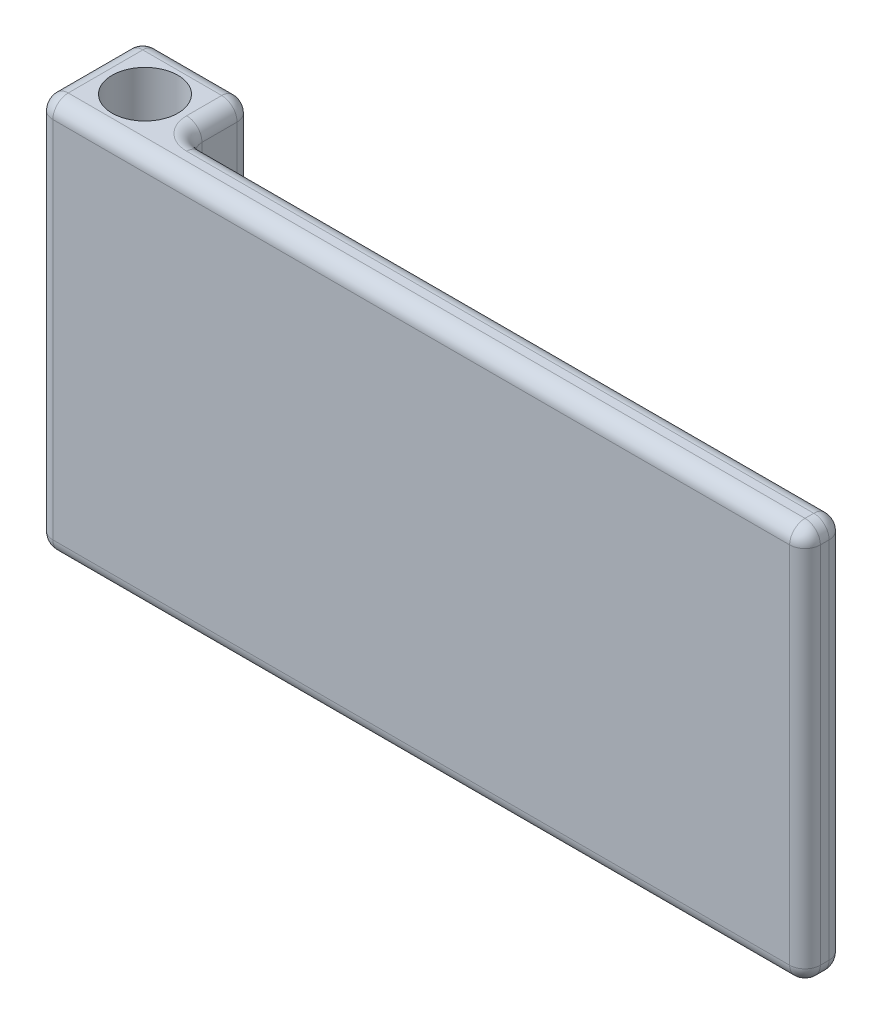
ISO-10303-21;
HEADER;
FILE_DESCRIPTION(('STEP AP214'),'2;1');
FILE_NAME('part.step','',(''),(''),'','','');
FILE_SCHEMA(('AUTOMOTIVE_DESIGN { 1 0 10303 214 1 1 1 1 }'));
ENDSEC;
DATA;
#1=APPLICATION_CONTEXT('core data for automotive mechanical design processes');
#2=APPLICATION_PROTOCOL_DEFINITION('international standard','automotive_design',2000,#1);
#3=PRODUCT_CONTEXT('',#1,'mechanical');
#4=PRODUCT('Part','Part','',(#3));
#5=PRODUCT_RELATED_PRODUCT_CATEGORY('part','',(#4));
#6=PRODUCT_DEFINITION_FORMATION('','',#4);
#7=PRODUCT_DEFINITION_CONTEXT('part definition',#1,'design');
#8=PRODUCT_DEFINITION('design','',#6,#7);
#9=PRODUCT_DEFINITION_SHAPE('','',#8);
#10=(LENGTH_UNIT() NAMED_UNIT(*) SI_UNIT(.MILLI.,.METRE.));
#11=(NAMED_UNIT(*) PLANE_ANGLE_UNIT() SI_UNIT($,.RADIAN.));
#12=(NAMED_UNIT(*) SI_UNIT($,.STERADIAN.) SOLID_ANGLE_UNIT());
#13=UNCERTAINTY_MEASURE_WITH_UNIT(LENGTH_MEASURE(1.E-05),#10,'distance_accuracy_value','');
#14=(GEOMETRIC_REPRESENTATION_CONTEXT(3) GLOBAL_UNCERTAINTY_ASSIGNED_CONTEXT((#13)) GLOBAL_UNIT_ASSIGNED_CONTEXT((#10,
#11,#12)) REPRESENTATION_CONTEXT('',''));
#15=CARTESIAN_POINT('',(0.,0.,0.));
#16=DIRECTION('',(0.,0.,1.));
#17=DIRECTION('',(1.,0.,0.));
#18=AXIS2_PLACEMENT_3D('',#15,#16,#17);
#19=CARTESIAN_POINT('',(0.,0.,-12.));
#20=DIRECTION('',(-1.,0.,0.));
#21=DIRECTION('',(0.,0.,1.));
#22=AXIS2_PLACEMENT_3D('',#19,#20,#21);
#23=PLANE('',#22);
#24=DIRECTION('',(0.,-1.,0.));
#25=VECTOR('',#24,1.);
#26=CARTESIAN_POINT('',(0.,0.,-8.5));
#27=LINE('',#26,#25);
#28=CARTESIAN_POINT('',(0.,86.5,-8.5));
#29=VERTEX_POINT('',#28);
#30=CARTESIAN_POINT('',(0.,3.5,-8.5));
#31=VERTEX_POINT('',#30);
#32=EDGE_CURVE('E349',#29,#31,#27,.T.);
#33=ORIENTED_EDGE('',*,*,#32,.T.);
#34=DIRECTION('',(0.,0.,1.));
#35=VECTOR('',#34,1.);
#36=CARTESIAN_POINT('',(0.,3.5,-12.));
#37=LINE('',#36,#35);
#38=CARTESIAN_POINT('',(0.,3.5,8.5));
#39=VERTEX_POINT('',#38);
#40=EDGE_CURVE('E427',#31,#39,#37,.T.);
#41=ORIENTED_EDGE('',*,*,#40,.T.);
#42=DIRECTION('',(0.,-1.,0.));
#43=VECTOR('',#42,1.);
#44=CARTESIAN_POINT('',(0.,86.5,8.5));
#45=LINE('',#44,#43);
#46=CARTESIAN_POINT('',(0.,86.5,8.5));
#47=VERTEX_POINT('',#46);
#48=EDGE_CURVE('E424',#39,#47,#45,.F.);
#49=ORIENTED_EDGE('',*,*,#48,.T.);
#50=DIRECTION('',(0.,0.,1.));
#51=VECTOR('',#50,1.);
#52=CARTESIAN_POINT('',(0.,86.5,-12.));
#53=LINE('',#52,#51);
#54=EDGE_CURVE('E421',#47,#29,#53,.F.);
#55=ORIENTED_EDGE('',*,*,#54,.T.);
#56=EDGE_LOOP('',(#33,#41,#49,#55));
#57=FACE_BOUND('',#56,.T.);
#58=ADVANCED_FACE('F47',(#57),#23,.T.);
#59=CARTESIAN_POINT('',(0.,90.,-12.));
#60=DIRECTION('',(0.,1.,0.));
#61=DIRECTION('',(0.,0.,1.));
#62=AXIS2_PLACEMENT_3D('',#59,#60,#61);
#63=PLANE('',#62);
#64=CARTESIAN_POINT('',(12.5,90.,0.));
#65=DIRECTION('',(0.,1.,0.));
#66=DIRECTION('',(0.,0.,1.));
#67=AXIS2_PLACEMENT_3D('',#64,#65,#66);
#68=CIRCLE('',#67,7.5);
#69=CARTESIAN_POINT('',(12.5,90.,7.5));
#70=VERTEX_POINT('',#69);
#71=EDGE_CURVE('E343',#70,#70,#68,.T.);
#72=ORIENTED_EDGE('',*,*,#71,.F.);
#73=EDGE_LOOP('',(#72));
#74=FACE_BOUND('',#73,.T.);
#75=DIRECTION('',(-1.,0.,0.));
#76=VECTOR('',#75,1.);
#77=CARTESIAN_POINT('',(0.,90.,-8.5));
#78=LINE('',#77,#76);
#79=CARTESIAN_POINT('',(21.5,90.,-8.5));
#80=VERTEX_POINT('',#79);
#81=CARTESIAN_POINT('',(3.5,90.,-8.5));
#82=VERTEX_POINT('',#81);
#83=EDGE_CURVE('E65',#80,#82,#78,.T.);
#84=ORIENTED_EDGE('',*,*,#83,.T.);
#85=DIRECTION('',(0.,0.,1.));
#86=VECTOR('',#85,1.);
#87=CARTESIAN_POINT('',(3.5,90.,-12.));
#88=LINE('',#87,#86);
#89=CARTESIAN_POINT('',(3.5,90.,8.5));
#90=VERTEX_POINT('',#89);
#91=EDGE_CURVE('E240',#82,#90,#88,.T.);
#92=ORIENTED_EDGE('',*,*,#91,.T.);
#93=DIRECTION('',(-1.,0.,0.));
#94=VECTOR('',#93,1.);
#95=CARTESIAN_POINT('',(175.,90.,8.5));
#96=LINE('',#95,#94);
#97=CARTESIAN_POINT('',(171.5,90.,8.5));
#98=VERTEX_POINT('',#97);
#99=EDGE_CURVE('E215',#90,#98,#96,.F.);
#100=ORIENTED_EDGE('',*,*,#99,.T.);
#101=DIRECTION('',(0.,0.,1.));
#102=VECTOR('',#101,1.);
#103=CARTESIAN_POINT('',(171.5,90.,-12.));
#104=LINE('',#103,#102);
#105=CARTESIAN_POINT('',(171.5,90.,6.5));
#106=VERTEX_POINT('',#105);
#107=EDGE_CURVE('E230',#98,#106,#104,.F.);
#108=ORIENTED_EDGE('',*,*,#107,.T.);
#109=DIRECTION('',(1.,0.,0.));
#110=VECTOR('',#109,1.);
#111=CARTESIAN_POINT('',(28.5,90.,6.5));
#112=LINE('',#111,#110);
#113=CARTESIAN_POINT('',(28.5,90.,6.5));
#114=VERTEX_POINT('',#113);
#115=EDGE_CURVE('E223',#106,#114,#112,.F.);
#116=ORIENTED_EDGE('',*,*,#115,.T.);
#117=CARTESIAN_POINT('',(28.5,90.,-0.499999999999997));
#118=DIRECTION('',(0.,1.,0.));
#119=DIRECTION('',(0.,0.,1.));
#120=AXIS2_PLACEMENT_3D('',#117,#118,#119);
#121=CIRCLE('',#120,7.);
#122=CARTESIAN_POINT('',(21.5,90.,-0.499999999999995));
#123=VERTEX_POINT('',#122);
#124=EDGE_CURVE('E233',#114,#123,#121,.F.);
#125=ORIENTED_EDGE('',*,*,#124,.T.);
#126=DIRECTION('',(0.,0.,1.));
#127=VECTOR('',#126,1.);
#128=CARTESIAN_POINT('',(21.5,90.,-8.5));
#129=LINE('',#128,#127);
#130=EDGE_CURVE('E70',#123,#80,#129,.F.);
#131=ORIENTED_EDGE('',*,*,#130,.T.);
#132=EDGE_LOOP('',(#84,#92,#100,#108,#116,#125,#131));
#133=FACE_BOUND('',#132,.T.);
#134=ADVANCED_FACE('F514',(#74,#133),#63,.T.);
#135=CARTESIAN_POINT('',(175.,0.,-12.));
#136=DIRECTION('',(1.,0.,0.));
#137=DIRECTION('',(0.,0.,-1.));
#138=AXIS2_PLACEMENT_3D('',#135,#136,#137);
#139=PLANE('',#138);
#140=DIRECTION('',(0.,1.,0.));
#141=VECTOR('',#140,1.);
#142=CARTESIAN_POINT('',(175.,0.,8.5));
#143=LINE('',#142,#141);
#144=CARTESIAN_POINT('',(175.,86.5,8.5));
#145=VERTEX_POINT('',#144);
#146=CARTESIAN_POINT('',(175.,3.5,8.5));
#147=VERTEX_POINT('',#146);
#148=EDGE_CURVE('E187',#145,#147,#143,.F.);
#149=ORIENTED_EDGE('',*,*,#148,.T.);
#150=DIRECTION('',(0.,0.,1.));
#151=VECTOR('',#150,1.);
#152=CARTESIAN_POINT('',(175.,3.5,-12.));
#153=LINE('',#152,#151);
#154=CARTESIAN_POINT('',(175.,3.5,6.5));
#155=VERTEX_POINT('',#154);
#156=EDGE_CURVE('E412',#147,#155,#153,.F.);
#157=ORIENTED_EDGE('',*,*,#156,.T.);
#158=DIRECTION('',(0.,1.,0.));
#159=VECTOR('',#158,1.);
#160=CARTESIAN_POINT('',(175.,90.,6.5));
#161=LINE('',#160,#159);
#162=CARTESIAN_POINT('',(175.,86.5,6.5));
#163=VERTEX_POINT('',#162);
#164=EDGE_CURVE('E376',#155,#163,#161,.T.);
#165=ORIENTED_EDGE('',*,*,#164,.T.);
#166=DIRECTION('',(0.,0.,1.));
#167=VECTOR('',#166,1.);
#168=CARTESIAN_POINT('',(175.,86.5,-12.));
#169=LINE('',#168,#167);
#170=EDGE_CURVE('E409',#163,#145,#169,.T.);
#171=ORIENTED_EDGE('',*,*,#170,.T.);
#172=EDGE_LOOP('',(#149,#157,#165,#171));
#173=FACE_BOUND('',#172,.T.);
#174=ADVANCED_FACE('F545',(#173),#139,.T.);
#175=CARTESIAN_POINT('',(0.,0.,-12.));
#176=DIRECTION('',(0.,-1.,0.));
#177=DIRECTION('',(0.,0.,-1.));
#178=AXIS2_PLACEMENT_3D('',#175,#176,#177);
#179=PLANE('',#178);
#180=DIRECTION('',(0.,0.,1.));
#181=VECTOR('',#180,1.);
#182=CARTESIAN_POINT('',(171.5,0.,-12.));
#183=LINE('',#182,#181);
#184=CARTESIAN_POINT('',(171.5,0.,6.5));
#185=VERTEX_POINT('',#184);
#186=CARTESIAN_POINT('',(171.5,0.,8.5));
#187=VERTEX_POINT('',#186);
#188=EDGE_CURVE('E402',#185,#187,#183,.T.);
#189=ORIENTED_EDGE('',*,*,#188,.T.);
#190=DIRECTION('',(1.,0.,0.));
#191=VECTOR('',#190,1.);
#192=CARTESIAN_POINT('',(0.,0.,8.5));
#193=LINE('',#192,#191);
#194=CARTESIAN_POINT('',(3.5,0.,8.5));
#195=VERTEX_POINT('',#194);
#196=EDGE_CURVE('E406',#187,#195,#193,.F.);
#197=ORIENTED_EDGE('',*,*,#196,.T.);
#198=DIRECTION('',(0.,0.,1.));
#199=VECTOR('',#198,1.);
#200=CARTESIAN_POINT('',(3.5,0.,-12.));
#201=LINE('',#200,#199);
#202=CARTESIAN_POINT('',(3.5,0.,-8.5));
#203=VERTEX_POINT('',#202);
#204=EDGE_CURVE('E399',#195,#203,#201,.F.);
#205=ORIENTED_EDGE('',*,*,#204,.T.);
#206=DIRECTION('',(1.,0.,0.));
#207=VECTOR('',#206,1.);
#208=CARTESIAN_POINT('',(0.,0.,-8.5));
#209=LINE('',#208,#207);
#210=CARTESIAN_POINT('',(21.5,0.,-8.5));
#211=VERTEX_POINT('',#210);
#212=EDGE_CURVE('E396',#203,#211,#209,.T.);
#213=ORIENTED_EDGE('',*,*,#212,.T.);
#214=DIRECTION('',(0.,0.,-1.));
#215=VECTOR('',#214,1.);
#216=CARTESIAN_POINT('',(21.5,0.,-0.499999999999997));
#217=LINE('',#216,#215);
#218=CARTESIAN_POINT('',(21.5,0.,-0.499999999999995));
#219=VERTEX_POINT('',#218);
#220=EDGE_CURVE('E393',#211,#219,#217,.F.);
#221=ORIENTED_EDGE('',*,*,#220,.T.);
#222=CARTESIAN_POINT('',(28.5,0.,-0.499999999999997));
#223=DIRECTION('',(0.,-1.,0.));
#224=DIRECTION('',(0.,0.,-1.));
#225=AXIS2_PLACEMENT_3D('',#222,#223,#224);
#226=CIRCLE('',#225,7.);
#227=CARTESIAN_POINT('',(28.5,0.,6.5));
#228=VERTEX_POINT('',#227);
#229=EDGE_CURVE('E390',#219,#228,#226,.F.);
#230=ORIENTED_EDGE('',*,*,#229,.T.);
#231=DIRECTION('',(-1.,0.,0.));
#232=VECTOR('',#231,1.);
#233=CARTESIAN_POINT('',(171.5,0.,6.5));
#234=LINE('',#233,#232);
#235=EDGE_CURVE('E387',#228,#185,#234,.F.);
#236=ORIENTED_EDGE('',*,*,#235,.T.);
#237=EDGE_LOOP('',(#189,#197,#205,#213,#221,#230,#236));
#238=FACE_BOUND('',#237,.T.);
#239=CARTESIAN_POINT('',(12.5,0.,0.));
#240=DIRECTION('',(0.,1.,0.));
#241=DIRECTION('',(0.,0.,1.));
#242=AXIS2_PLACEMENT_3D('',#239,#240,#241);
#243=CIRCLE('',#242,7.5);
#244=CARTESIAN_POINT('',(12.5,0.,7.5));
#245=VERTEX_POINT('',#244);
#246=EDGE_CURVE('E338',#245,#245,#243,.T.);
#247=ORIENTED_EDGE('',*,*,#246,.T.);
#248=EDGE_LOOP('',(#247));
#249=FACE_BOUND('',#248,.T.);
#250=ADVANCED_FACE('F482',(#238,#249),#179,.T.);
#251=CARTESIAN_POINT('',(0.,0.,-12.));
#252=DIRECTION('',(0.,0.,-1.));
#253=DIRECTION('',(-1.,0.,0.));
#254=AXIS2_PLACEMENT_3D('',#251,#252,#253);
#255=PLANE('',#254);
#256=DIRECTION('',(0.,1.,0.));
#257=VECTOR('',#256,1.);
#258=CARTESIAN_POINT('',(21.5,0.,-12.));
#259=LINE('',#258,#257);
#260=CARTESIAN_POINT('',(21.5,86.5,-12.));
#261=VERTEX_POINT('',#260);
#262=CARTESIAN_POINT('',(21.5,3.5,-12.));
#263=VERTEX_POINT('',#262);
#264=EDGE_CURVE('E355',#261,#263,#259,.F.);
#265=ORIENTED_EDGE('',*,*,#264,.T.);
#266=DIRECTION('',(1.,0.,0.));
#267=VECTOR('',#266,1.);
#268=CARTESIAN_POINT('',(0.,3.5,-12.));
#269=LINE('',#268,#267);
#270=CARTESIAN_POINT('',(3.5,3.5,-12.));
#271=VERTEX_POINT('',#270);
#272=EDGE_CURVE('E439',#263,#271,#269,.F.);
#273=ORIENTED_EDGE('',*,*,#272,.T.);
#274=DIRECTION('',(0.,-1.,0.));
#275=VECTOR('',#274,1.);
#276=CARTESIAN_POINT('',(3.5,0.,-12.));
#277=LINE('',#276,#275);
#278=CARTESIAN_POINT('',(3.5,86.5,-12.));
#279=VERTEX_POINT('',#278);
#280=EDGE_CURVE('E359',#271,#279,#277,.F.);
#281=ORIENTED_EDGE('',*,*,#280,.T.);
#282=DIRECTION('',(-1.,0.,0.));
#283=VECTOR('',#282,1.);
#284=CARTESIAN_POINT('',(0.,86.5,-12.));
#285=LINE('',#284,#283);
#286=EDGE_CURVE('E436',#279,#261,#285,.F.);
#287=ORIENTED_EDGE('',*,*,#286,.T.);
#288=EDGE_LOOP('',(#265,#273,#281,#287));
#289=FACE_BOUND('',#288,.T.);
#290=ADVANCED_FACE('F499',(#289),#255,.T.);
#291=CARTESIAN_POINT('',(0.,0.,12.));
#292=DIRECTION('',(0.,0.,-1.));
#293=DIRECTION('',(-1.,0.,0.));
#294=AXIS2_PLACEMENT_3D('',#291,#292,#293);
#295=PLANE('',#294);
#296=DIRECTION('',(-1.,0.,0.));
#297=VECTOR('',#296,1.);
#298=CARTESIAN_POINT('',(0.,86.5,12.));
#299=LINE('',#298,#297);
#300=CARTESIAN_POINT('',(171.5,86.5,12.));
#301=VERTEX_POINT('',#300);
#302=CARTESIAN_POINT('',(3.5,86.5,12.));
#303=VERTEX_POINT('',#302);
#304=EDGE_CURVE('E200',#301,#303,#299,.T.);
#305=ORIENTED_EDGE('',*,*,#304,.T.);
#306=DIRECTION('',(0.,-1.,0.));
#307=VECTOR('',#306,1.);
#308=CARTESIAN_POINT('',(3.5,0.,12.));
#309=LINE('',#308,#307);
#310=CARTESIAN_POINT('',(3.5,3.5,12.));
#311=VERTEX_POINT('',#310);
#312=EDGE_CURVE('E219',#303,#311,#309,.T.);
#313=ORIENTED_EDGE('',*,*,#312,.T.);
#314=DIRECTION('',(1.,0.,0.));
#315=VECTOR('',#314,1.);
#316=CARTESIAN_POINT('',(171.5,3.5,12.));
#317=LINE('',#316,#315);
#318=CARTESIAN_POINT('',(171.5,3.5,12.));
#319=VERTEX_POINT('',#318);
#320=EDGE_CURVE('E203',#311,#319,#317,.T.);
#321=ORIENTED_EDGE('',*,*,#320,.T.);
#322=DIRECTION('',(0.,1.,0.));
#323=VECTOR('',#322,1.);
#324=CARTESIAN_POINT('',(171.5,90.,12.));
#325=LINE('',#324,#323);
#326=EDGE_CURVE('E184',#319,#301,#325,.T.);
#327=ORIENTED_EDGE('',*,*,#326,.T.);
#328=EDGE_LOOP('',(#305,#313,#321,#327));
#329=FACE_BOUND('',#328,.T.);
#330=ADVANCED_FACE('F199',(#329),#295,.F.);
#331=CARTESIAN_POINT('',(25.,-1.2E-05,-12.));
#332=DIRECTION('',(-1.,0.,0.));
#333=DIRECTION('',(0.,0.,1.));
#334=AXIS2_PLACEMENT_3D('',#331,#332,#333);
#335=PLANE('',#334);
#336=DIRECTION('',(0.,1.,0.));
#337=VECTOR('',#336,1.);
#338=CARTESIAN_POINT('',(25.,0.,-0.499999999999996));
#339=LINE('',#338,#337);
#340=CARTESIAN_POINT('',(25.,86.5,-0.499999999999996));
#341=VERTEX_POINT('',#340);
#342=CARTESIAN_POINT('',(25.,3.5,-0.499999999999996));
#343=VERTEX_POINT('',#342);
#344=EDGE_CURVE('E363',#341,#343,#339,.F.);
#345=ORIENTED_EDGE('',*,*,#344,.T.);
#346=DIRECTION('',(0.,0.,-1.));
#347=VECTOR('',#346,1.);
#348=CARTESIAN_POINT('',(25.,3.5,-8.5));
#349=LINE('',#348,#347);
#350=CARTESIAN_POINT('',(25.,3.5,-8.5));
#351=VERTEX_POINT('',#350);
#352=EDGE_CURVE('E451',#343,#351,#349,.T.);
#353=ORIENTED_EDGE('',*,*,#352,.T.);
#354=DIRECTION('',(0.,1.,0.));
#355=VECTOR('',#354,1.);
#356=CARTESIAN_POINT('',(25.,90.,-8.5));
#357=LINE('',#356,#355);
#358=CARTESIAN_POINT('',(25.,86.5,-8.5));
#359=VERTEX_POINT('',#358);
#360=EDGE_CURVE('E367',#351,#359,#357,.T.);
#361=ORIENTED_EDGE('',*,*,#360,.T.);
#362=DIRECTION('',(0.,0.,1.));
#363=VECTOR('',#362,1.);
#364=CARTESIAN_POINT('',(25.,86.5,-0.499999999999998));
#365=LINE('',#364,#363);
#366=EDGE_CURVE('E448',#359,#341,#365,.T.);
#367=ORIENTED_EDGE('',*,*,#366,.T.);
#368=EDGE_LOOP('',(#345,#353,#361,#367));
#369=FACE_BOUND('',#368,.T.);
#370=ADVANCED_FACE('F470',(#369),#335,.F.);
#371=CARTESIAN_POINT('',(25.,-1.2E-05,3.));
#372=DIRECTION('',(0.,0.,1.));
#373=DIRECTION('',(1.,0.,0.));
#374=AXIS2_PLACEMENT_3D('',#371,#372,#373);
#375=PLANE('',#374);
#376=DIRECTION('',(0.,1.,0.));
#377=VECTOR('',#376,1.);
#378=CARTESIAN_POINT('',(171.5,0.,3.));
#379=LINE('',#378,#377);
#380=CARTESIAN_POINT('',(171.5,86.5,3.));
#381=VERTEX_POINT('',#380);
#382=CARTESIAN_POINT('',(171.5,3.5,3.));
#383=VERTEX_POINT('',#382);
#384=EDGE_CURVE('E194',#381,#383,#379,.F.);
#385=ORIENTED_EDGE('',*,*,#384,.T.);
#386=DIRECTION('',(-1.,0.,0.));
#387=VECTOR('',#386,1.);
#388=CARTESIAN_POINT('',(28.5,3.5,3.));
#389=LINE('',#388,#387);
#390=CARTESIAN_POINT('',(28.5,3.5,3.));
#391=VERTEX_POINT('',#390);
#392=EDGE_CURVE('E11',#383,#391,#389,.T.);
#393=ORIENTED_EDGE('',*,*,#392,.T.);
#394=DIRECTION('',(0.,1.,0.));
#395=VECTOR('',#394,1.);
#396=CARTESIAN_POINT('',(28.5,90.,3.));
#397=LINE('',#396,#395);
#398=CARTESIAN_POINT('',(28.5,86.5,3.));
#399=VERTEX_POINT('',#398);
#400=EDGE_CURVE('E205',#391,#399,#397,.T.);
#401=ORIENTED_EDGE('',*,*,#400,.T.);
#402=DIRECTION('',(1.,0.,0.));
#403=VECTOR('',#402,1.);
#404=CARTESIAN_POINT('',(171.5,86.5,3.));
#405=LINE('',#404,#403);
#406=EDGE_CURVE('E57',#399,#381,#405,.T.);
#407=ORIENTED_EDGE('',*,*,#406,.T.);
#408=EDGE_LOOP('',(#385,#393,#401,#407));
#409=FACE_BOUND('',#408,.T.);
#410=ADVANCED_FACE('F819',(#409),#375,.F.);
#411=CARTESIAN_POINT('',(12.5,0.,0.));
#412=DIRECTION('',(0.,1.,0.));
#413=DIRECTION('',(0.,0.,1.));
#414=AXIS2_PLACEMENT_3D('',#411,#412,#413);
#415=CYLINDRICAL_SURFACE('',#414,7.5);
#416=CARTESIAN_POINT('',(12.5,90.,7.5));
#417=CARTESIAN_POINT('',(12.5,89.0625,7.5));
#418=CARTESIAN_POINT('',(12.5,88.125,7.5));
#419=CARTESIAN_POINT('',(12.5,86.25,7.5));
#420=CARTESIAN_POINT('',(12.5,85.3125,7.5));
#421=CARTESIAN_POINT('',(12.5,83.4375,7.5));
#422=CARTESIAN_POINT('',(12.5,82.5,7.5));
#423=CARTESIAN_POINT('',(12.5,80.625,7.5));
#424=CARTESIAN_POINT('',(12.5,79.6875,7.5));
#425=CARTESIAN_POINT('',(12.5,77.8125,7.5));
#426=CARTESIAN_POINT('',(12.5,76.875,7.5));
#427=CARTESIAN_POINT('',(12.5,75.,7.5));
#428=CARTESIAN_POINT('',(12.5,74.0625,7.5));
#429=CARTESIAN_POINT('',(12.5,72.1875,7.5));
#430=CARTESIAN_POINT('',(12.5,71.25,7.5));
#431=CARTESIAN_POINT('',(12.5,69.375,7.5));
#432=CARTESIAN_POINT('',(12.5,68.4375,7.5));
#433=CARTESIAN_POINT('',(12.5,66.5625,7.5));
#434=CARTESIAN_POINT('',(12.5,65.625,7.5));
#435=CARTESIAN_POINT('',(12.5,63.75,7.5));
#436=CARTESIAN_POINT('',(12.5,62.8125,7.5));
#437=CARTESIAN_POINT('',(12.5,60.9375,7.5));
#438=CARTESIAN_POINT('',(12.5,60.,7.5));
#439=CARTESIAN_POINT('',(12.5,58.125,7.5));
#440=CARTESIAN_POINT('',(12.5,57.1875,7.5));
#441=CARTESIAN_POINT('',(12.5,55.3125,7.5));
#442=CARTESIAN_POINT('',(12.5,54.375,7.5));
#443=CARTESIAN_POINT('',(12.5,52.5,7.5));
#444=CARTESIAN_POINT('',(12.5,51.5625,7.5));
#445=CARTESIAN_POINT('',(12.5,49.6875,7.5));
#446=CARTESIAN_POINT('',(12.5,48.75,7.5));
#447=CARTESIAN_POINT('',(12.5,46.875,7.5));
#448=CARTESIAN_POINT('',(12.5,45.9375,7.5));
#449=CARTESIAN_POINT('',(12.5,44.0625,7.5));
#450=CARTESIAN_POINT('',(12.5,43.125,7.5));
#451=CARTESIAN_POINT('',(12.5,41.25,7.5));
#452=CARTESIAN_POINT('',(12.5,40.3125,7.5));
#453=CARTESIAN_POINT('',(12.5,38.4375,7.5));
#454=CARTESIAN_POINT('',(12.5,37.5,7.5));
#455=CARTESIAN_POINT('',(12.5,35.625,7.5));
#456=CARTESIAN_POINT('',(12.5,34.6875,7.5));
#457=CARTESIAN_POINT('',(12.5,32.8125,7.5));
#458=CARTESIAN_POINT('',(12.5,31.875,7.5));
#459=CARTESIAN_POINT('',(12.5,30.,7.5));
#460=CARTESIAN_POINT('',(12.5,29.0625,7.5));
#461=CARTESIAN_POINT('',(12.5,27.1875,7.5));
#462=CARTESIAN_POINT('',(12.5,26.25,7.5));
#463=CARTESIAN_POINT('',(12.5,24.375,7.5));
#464=CARTESIAN_POINT('',(12.5,23.4375,7.5));
#465=CARTESIAN_POINT('',(12.5,21.5625,7.5));
#466=CARTESIAN_POINT('',(12.5,20.625,7.5));
#467=CARTESIAN_POINT('',(12.5,18.75,7.5));
#468=CARTESIAN_POINT('',(12.5,17.8125,7.5));
#469=CARTESIAN_POINT('',(12.5,15.9375,7.5));
#470=CARTESIAN_POINT('',(12.5,15.,7.5));
#471=CARTESIAN_POINT('',(12.5,13.125,7.5));
#472=CARTESIAN_POINT('',(12.5,12.1875,7.5));
#473=CARTESIAN_POINT('',(12.5,10.3125,7.5));
#474=CARTESIAN_POINT('',(12.5,9.375,7.5));
#475=CARTESIAN_POINT('',(12.5,7.5,7.5));
#476=CARTESIAN_POINT('',(12.5,6.5625,7.5));
#477=CARTESIAN_POINT('',(12.5,4.6875,7.5));
#478=CARTESIAN_POINT('',(12.5,3.75,7.5));
#479=CARTESIAN_POINT('',(12.5,1.875,7.5));
#480=CARTESIAN_POINT('',(12.5,0.9375,7.5));
#481=CARTESIAN_POINT('',(12.5,0.,7.5));
#482=B_SPLINE_CURVE_WITH_KNOTS('',3,(#416,#417,#418,#419,#420,#421,#422,#423,#424,#425,#426,
#427,#428,#429,#430,#431,#432,#433,#434,#435,#436,#437,#438,#439,#440,#441,#442,#443,#444,#445,
#446,#447,#448,#449,#450,#451,#452,#453,#454,#455,#456,#457,#458,#459,#460,#461,#462,#463,#464,
#465,#466,#467,#468,#469,#470,#471,#472,#473,#474,#475,#476,#477,#478,#479,#480,#481),
.UNSPECIFIED.,.F.,.F.,(4,2,2,2,2,2,2,2,2,2,2,2,2,2,2,2,2,2,2,2,2,2,2,2,2,2,2,2,2,2,2,2,4),(0.,
2.8125,5.62500000000001,8.4375,11.25,14.0625,16.875,19.6875,22.5,25.3125,28.125,30.9375,33.75,
36.5625,39.375,42.1875,45.,47.8125,50.625,53.4375,56.25,59.0625,61.875,64.6875,67.5,70.3125,
73.125,75.9375,78.75,81.5625,84.375,87.1875,90.),.UNSPECIFIED.);
#483=EDGE_CURVE('BSEAM554',#70,#245,#482,.T.);
#484=ORIENTED_EDGE('',*,*,#71,.T.);
#485=ORIENTED_EDGE('',*,*,#246,.F.);
#486=ORIENTED_EDGE('',*,*,#483,.T.);
#487=ORIENTED_EDGE('',*,*,#483,.F.);
#488=EDGE_LOOP('',(#484,#486,#485,#487));
#489=FACE_BOUND('',#488,.T.);
#490=ADVANCED_FACE('F554',(#489),#415,.F.);
#491=CARTESIAN_POINT('',(3.5,0.,-8.5));
#492=DIRECTION('',(0.,-1.,0.));
#493=DIRECTION('',(0.,0.,-1.));
#494=AXIS2_PLACEMENT_3D('',#491,#492,#493);
#495=CYLINDRICAL_SURFACE('',#494,3.5);
#496=ORIENTED_EDGE('',*,*,#280,.F.);
#497=CARTESIAN_POINT('',(3.5,3.5,-8.5));
#498=DIRECTION('',(0.,-1.,0.));
#499=DIRECTION('',(0.,0.,-1.));
#500=AXIS2_PLACEMENT_3D('',#497,#498,#499);
#501=CIRCLE('',#500,3.5);
#502=EDGE_CURVE('E433',#271,#31,#501,.F.);
#503=ORIENTED_EDGE('',*,*,#502,.T.);
#504=ORIENTED_EDGE('',*,*,#32,.F.);
#505=CARTESIAN_POINT('',(3.5,86.5,-8.5));
#506=DIRECTION('',(0.,-1.,0.));
#507=DIRECTION('',(0.,0.,-1.));
#508=AXIS2_PLACEMENT_3D('',#505,#506,#507);
#509=CIRCLE('',#508,3.5);
#510=EDGE_CURVE('E430',#29,#279,#509,.T.);
#511=ORIENTED_EDGE('',*,*,#510,.T.);
#512=EDGE_LOOP('',(#496,#503,#504,#511));
#513=FACE_BOUND('',#512,.T.);
#514=ADVANCED_FACE('F551',(#513),#495,.T.);
#515=CARTESIAN_POINT('',(21.5,-1.2E-05,-8.5));
#516=DIRECTION('',(0.,-1.,0.));
#517=DIRECTION('',(0.,0.,-1.));
#518=AXIS2_PLACEMENT_3D('',#515,#516,#517);
#519=CYLINDRICAL_SURFACE('',#518,3.5);
#520=ORIENTED_EDGE('',*,*,#360,.F.);
#521=CARTESIAN_POINT('',(21.5,3.5,-8.5));
#522=DIRECTION('',(0.,-1.,0.));
#523=DIRECTION('',(0.,0.,-1.));
#524=AXIS2_PLACEMENT_3D('',#521,#522,#523);
#525=CIRCLE('',#524,3.5);
#526=EDGE_CURVE('E445',#351,#263,#525,.F.);
#527=ORIENTED_EDGE('',*,*,#526,.T.);
#528=ORIENTED_EDGE('',*,*,#264,.F.);
#529=CARTESIAN_POINT('',(21.5,86.5,-8.5));
#530=DIRECTION('',(0.,-1.,0.));
#531=DIRECTION('',(0.,0.,-1.));
#532=AXIS2_PLACEMENT_3D('',#529,#530,#531);
#533=CIRCLE('',#532,3.5);
#534=EDGE_CURVE('E442',#261,#359,#533,.T.);
#535=ORIENTED_EDGE('',*,*,#534,.T.);
#536=EDGE_LOOP('',(#520,#527,#528,#535));
#537=FACE_BOUND('',#536,.T.);
#538=ADVANCED_FACE('F496',(#537),#519,.T.);
#539=CARTESIAN_POINT('',(28.5,-1.2E-05,-0.499999999999997));
#540=DIRECTION('',(0.,-1.,0.));
#541=DIRECTION('',(0.,0.,-1.));
#542=AXIS2_PLACEMENT_3D('',#539,#540,#541);
#543=CYLINDRICAL_SURFACE('',#542,3.5);
#544=ORIENTED_EDGE('',*,*,#400,.F.);
#545=CARTESIAN_POINT('',(28.5,3.5,-0.499999999999997));
#546=DIRECTION('',(0.,-1.,0.));
#547=DIRECTION('',(0.,0.,-1.));
#548=AXIS2_PLACEMENT_3D('',#545,#546,#547);
#549=CIRCLE('',#548,3.5);
#550=EDGE_CURVE('E457',#391,#343,#549,.T.);
#551=ORIENTED_EDGE('',*,*,#550,.T.);
#552=ORIENTED_EDGE('',*,*,#344,.F.);
#553=CARTESIAN_POINT('',(28.5,86.5,-0.499999999999997));
#554=DIRECTION('',(0.,1.,0.));
#555=DIRECTION('',(0.,0.,1.));
#556=AXIS2_PLACEMENT_3D('',#553,#554,#555);
#557=CIRCLE('',#556,3.5);
#558=EDGE_CURVE('E454',#341,#399,#557,.T.);
#559=ORIENTED_EDGE('',*,*,#558,.T.);
#560=EDGE_LOOP('',(#544,#551,#552,#559));
#561=FACE_BOUND('',#560,.T.);
#562=ADVANCED_FACE('F464',(#561),#543,.F.);
#563=CARTESIAN_POINT('',(171.5,0.,8.5));
#564=DIRECTION('',(0.,-1.,0.));
#565=DIRECTION('',(0.,0.,-1.));
#566=AXIS2_PLACEMENT_3D('',#563,#564,#565);
#567=CYLINDRICAL_SURFACE('',#566,3.5);
#568=ORIENTED_EDGE('',*,*,#326,.F.);
#569=CARTESIAN_POINT('',(171.5,3.5,8.5));
#570=DIRECTION('',(0.,-1.,0.));
#571=DIRECTION('',(0.,0.,-1.));
#572=AXIS2_PLACEMENT_3D('',#569,#570,#571);
#573=CIRCLE('',#572,3.5);
#574=EDGE_CURVE('E193',#319,#147,#573,.F.);
#575=ORIENTED_EDGE('',*,*,#574,.T.);
#576=ORIENTED_EDGE('',*,*,#148,.F.);
#577=CARTESIAN_POINT('',(171.5,86.5,8.5));
#578=DIRECTION('',(0.,-1.,0.));
#579=DIRECTION('',(0.,0.,-1.));
#580=AXIS2_PLACEMENT_3D('',#577,#578,#579);
#581=CIRCLE('',#580,3.5);
#582=EDGE_CURVE('E180',#145,#301,#581,.T.);
#583=ORIENTED_EDGE('',*,*,#582,.T.);
#584=EDGE_LOOP('',(#568,#575,#576,#583));
#585=FACE_BOUND('',#584,.T.);
#586=ADVANCED_FACE('F182',(#585),#567,.T.);
#587=CARTESIAN_POINT('',(0.,86.5,8.5));
#588=DIRECTION('',(1.,0.,0.));
#589=DIRECTION('',(0.,0.,-1.));
#590=AXIS2_PLACEMENT_3D('',#587,#588,#589);
#591=CYLINDRICAL_SURFACE('',#590,3.5);
#592=ORIENTED_EDGE('',*,*,#99,.F.);
#593=CARTESIAN_POINT('',(3.5,86.5,8.5));
#594=DIRECTION('',(1.,0.,0.));
#595=DIRECTION('',(0.,0.,-1.));
#596=AXIS2_PLACEMENT_3D('',#593,#594,#595);
#597=CIRCLE('',#596,3.5);
#598=EDGE_CURVE('E213',#90,#303,#597,.T.);
#599=ORIENTED_EDGE('',*,*,#598,.T.);
#600=ORIENTED_EDGE('',*,*,#304,.F.);
#601=CARTESIAN_POINT('',(171.5,86.5,8.5));
#602=DIRECTION('',(1.,0.,0.));
#603=DIRECTION('',(0.,0.,-1.));
#604=AXIS2_PLACEMENT_3D('',#601,#602,#603);
#605=CIRCLE('',#604,3.5);
#606=EDGE_CURVE('E210',#301,#98,#605,.F.);
#607=ORIENTED_EDGE('',*,*,#606,.T.);
#608=EDGE_LOOP('',(#592,#599,#600,#607));
#609=FACE_BOUND('',#608,.T.);
#610=ADVANCED_FACE('F209',(#609),#591,.T.);
#611=CARTESIAN_POINT('',(171.5,0.,6.5));
#612=DIRECTION('',(0.,-1.,0.));
#613=DIRECTION('',(0.,0.,-1.));
#614=AXIS2_PLACEMENT_3D('',#611,#612,#613);
#615=CYLINDRICAL_SURFACE('',#614,3.5);
#616=ORIENTED_EDGE('',*,*,#164,.F.);
#617=CARTESIAN_POINT('',(171.5,3.5,6.5));
#618=DIRECTION('',(0.,-1.,0.));
#619=DIRECTION('',(0.,0.,-1.));
#620=AXIS2_PLACEMENT_3D('',#617,#618,#619);
#621=CIRCLE('',#620,3.5);
#622=EDGE_CURVE('E418',#155,#383,#621,.F.);
#623=ORIENTED_EDGE('',*,*,#622,.T.);
#624=ORIENTED_EDGE('',*,*,#384,.F.);
#625=CARTESIAN_POINT('',(171.5,86.5,6.5));
#626=DIRECTION('',(0.,-1.,0.));
#627=DIRECTION('',(0.,0.,-1.));
#628=AXIS2_PLACEMENT_3D('',#625,#626,#627);
#629=CIRCLE('',#628,3.5);
#630=EDGE_CURVE('E415',#381,#163,#629,.T.);
#631=ORIENTED_EDGE('',*,*,#630,.T.);
#632=EDGE_LOOP('',(#616,#623,#624,#631));
#633=FACE_BOUND('',#632,.T.);
#634=ADVANCED_FACE('F562',(#633),#615,.T.);
#635=CARTESIAN_POINT('',(171.5,86.5,8.5));
#636=DIRECTION('',(0.,0.,1.));
#637=DIRECTION('',(1.,0.,0.));
#638=AXIS2_PLACEMENT_3D('',#635,#636,#637);
#639=SPHERICAL_SURFACE('',#638,3.5);
#640=ORIENTED_EDGE('',*,*,#606,.F.);
#641=ORIENTED_EDGE('',*,*,#582,.F.);
#642=CARTESIAN_POINT('',(171.5,86.5,8.5));
#643=DIRECTION('',(0.,0.,-1.));
#644=DIRECTION('',(-1.,0.,0.));
#645=AXIS2_PLACEMENT_3D('',#642,#643,#644);
#646=CIRCLE('',#645,3.5);
#647=EDGE_CURVE('E51',#98,#145,#646,.T.);
#648=ORIENTED_EDGE('',*,*,#647,.F.);
#649=EDGE_LOOP('',(#640,#641,#648));
#650=FACE_BOUND('',#649,.T.);
#651=ADVANCED_FACE('F49',(#650),#639,.T.);
#652=CARTESIAN_POINT('',(171.5,86.5,-12.));
#653=DIRECTION('',(0.,0.,1.));
#654=DIRECTION('',(1.,0.,0.));
#655=AXIS2_PLACEMENT_3D('',#652,#653,#654);
#656=CYLINDRICAL_SURFACE('',#655,3.5);
#657=ORIENTED_EDGE('',*,*,#647,.T.);
#658=ORIENTED_EDGE('',*,*,#170,.F.);
#659=CARTESIAN_POINT('',(171.5,86.5,6.5));
#660=DIRECTION('',(0.,0.,-1.));
#661=DIRECTION('',(-1.,0.,0.));
#662=AXIS2_PLACEMENT_3D('',#659,#660,#661);
#663=CIRCLE('',#662,3.5);
#664=EDGE_CURVE('E330',#106,#163,#663,.T.);
#665=ORIENTED_EDGE('',*,*,#664,.F.);
#666=ORIENTED_EDGE('',*,*,#107,.F.);
#667=EDGE_LOOP('',(#657,#658,#665,#666));
#668=FACE_BOUND('',#667,.T.);
#669=ADVANCED_FACE('F517',(#668),#656,.T.);
#670=CARTESIAN_POINT('',(171.5,86.5,6.5));
#671=DIRECTION('',(0.,1.,0.));
#672=DIRECTION('',(0.,0.,1.));
#673=AXIS2_PLACEMENT_3D('',#670,#671,#672);
#674=SPHERICAL_SURFACE('',#673,3.5);
#675=ORIENTED_EDGE('',*,*,#664,.T.);
#676=ORIENTED_EDGE('',*,*,#630,.F.);
#677=CARTESIAN_POINT('',(171.5,86.5,6.5));
#678=DIRECTION('',(-1.,0.,0.));
#679=DIRECTION('',(0.,0.,1.));
#680=AXIS2_PLACEMENT_3D('',#677,#678,#679);
#681=CIRCLE('',#680,3.5);
#682=EDGE_CURVE('E327',#106,#381,#681,.T.);
#683=ORIENTED_EDGE('',*,*,#682,.F.);
#684=EDGE_LOOP('',(#675,#676,#683));
#685=FACE_BOUND('',#684,.T.);
#686=ADVANCED_FACE('F518',(#685),#674,.T.);
#687=CARTESIAN_POINT('',(25.,86.5,6.5));
#688=DIRECTION('',(-1.,0.,0.));
#689=DIRECTION('',(0.,0.,1.));
#690=AXIS2_PLACEMENT_3D('',#687,#688,#689);
#691=CYLINDRICAL_SURFACE('',#690,3.5);
#692=ORIENTED_EDGE('',*,*,#682,.T.);
#693=ORIENTED_EDGE('',*,*,#406,.F.);
#694=CARTESIAN_POINT('',(28.5,86.5,6.5));
#695=DIRECTION('',(-1.,0.,0.));
#696=DIRECTION('',(0.,0.,1.));
#697=AXIS2_PLACEMENT_3D('',#694,#695,#696);
#698=CIRCLE('',#697,3.5);
#699=EDGE_CURVE('E323',#114,#399,#698,.T.);
#700=ORIENTED_EDGE('',*,*,#699,.F.);
#701=ORIENTED_EDGE('',*,*,#115,.F.);
#702=EDGE_LOOP('',(#692,#693,#700,#701));
#703=FACE_BOUND('',#702,.T.);
#704=ADVANCED_FACE('F521',(#703),#691,.T.);
#705=CARTESIAN_POINT('',(28.5,86.5,-0.499999999999997));
#706=DIRECTION('',(0.,1.,0.));
#707=DIRECTION('',(0.,0.,1.));
#708=AXIS2_PLACEMENT_3D('',#705,#706,#707);
#709=TOROIDAL_SURFACE('',#708,7.,3.5);
#710=ORIENTED_EDGE('',*,*,#699,.T.);
#711=ORIENTED_EDGE('',*,*,#558,.F.);
#712=CARTESIAN_POINT('',(21.5,86.5,-0.499999999999995));
#713=DIRECTION('',(0.,0.,-1.));
#714=DIRECTION('',(-1.,0.,0.));
#715=AXIS2_PLACEMENT_3D('',#712,#713,#714);
#716=CIRCLE('',#715,3.5);
#717=EDGE_CURVE('E319',#123,#341,#716,.T.);
#718=ORIENTED_EDGE('',*,*,#717,.F.);
#719=ORIENTED_EDGE('',*,*,#124,.F.);
#720=EDGE_LOOP('',(#710,#711,#718,#719));
#721=FACE_BOUND('',#720,.T.);
#722=ADVANCED_FACE('F525',(#721),#709,.T.);
#723=CARTESIAN_POINT('',(21.5,86.5,-12.));
#724=DIRECTION('',(0.,0.,-1.));
#725=DIRECTION('',(-1.,0.,0.));
#726=AXIS2_PLACEMENT_3D('',#723,#724,#725);
#727=CYLINDRICAL_SURFACE('',#726,3.5);
#728=ORIENTED_EDGE('',*,*,#717,.T.);
#729=ORIENTED_EDGE('',*,*,#366,.F.);
#730=CARTESIAN_POINT('',(21.5,86.5,-8.5));
#731=DIRECTION('',(0.,0.,-1.));
#732=DIRECTION('',(-1.,0.,0.));
#733=AXIS2_PLACEMENT_3D('',#730,#731,#732);
#734=CIRCLE('',#733,3.5);
#735=EDGE_CURVE('E315',#80,#359,#734,.T.);
#736=ORIENTED_EDGE('',*,*,#735,.F.);
#737=ORIENTED_EDGE('',*,*,#130,.F.);
#738=EDGE_LOOP('',(#728,#729,#736,#737));
#739=FACE_BOUND('',#738,.T.);
#740=ADVANCED_FACE('F527',(#739),#727,.T.);
#741=CARTESIAN_POINT('',(21.5,86.5,-8.5));
#742=DIRECTION('',(0.,1.,0.));
#743=DIRECTION('',(0.,0.,1.));
#744=AXIS2_PLACEMENT_3D('',#741,#742,#743);
#745=SPHERICAL_SURFACE('',#744,3.5);
#746=ORIENTED_EDGE('',*,*,#735,.T.);
#747=ORIENTED_EDGE('',*,*,#534,.F.);
#748=CARTESIAN_POINT('',(21.5,86.5,-8.5));
#749=DIRECTION('',(-1.,0.,0.));
#750=DIRECTION('',(0.,0.,1.));
#751=AXIS2_PLACEMENT_3D('',#748,#749,#750);
#752=CIRCLE('',#751,3.5);
#753=EDGE_CURVE('E311',#80,#261,#752,.T.);
#754=ORIENTED_EDGE('',*,*,#753,.F.);
#755=EDGE_LOOP('',(#746,#747,#754));
#756=FACE_BOUND('',#755,.T.);
#757=ADVANCED_FACE('F529',(#756),#745,.T.);
#758=CARTESIAN_POINT('',(0.,86.5,-8.5));
#759=DIRECTION('',(-1.,0.,0.));
#760=DIRECTION('',(0.,0.,1.));
#761=AXIS2_PLACEMENT_3D('',#758,#759,#760);
#762=CYLINDRICAL_SURFACE('',#761,3.5);
#763=ORIENTED_EDGE('',*,*,#753,.T.);
#764=ORIENTED_EDGE('',*,*,#286,.F.);
#765=CARTESIAN_POINT('',(3.5,86.5,-8.5));
#766=DIRECTION('',(-1.,0.,0.));
#767=DIRECTION('',(0.,0.,1.));
#768=AXIS2_PLACEMENT_3D('',#765,#766,#767);
#769=CIRCLE('',#768,3.5);
#770=EDGE_CURVE('E307',#82,#279,#769,.T.);
#771=ORIENTED_EDGE('',*,*,#770,.F.);
#772=ORIENTED_EDGE('',*,*,#83,.F.);
#773=EDGE_LOOP('',(#763,#764,#771,#772));
#774=FACE_BOUND('',#773,.T.);
#775=ADVANCED_FACE('F503',(#774),#762,.T.);
#776=CARTESIAN_POINT('',(21.5,3.5,-8.5));
#777=DIRECTION('',(0.,-1.,0.));
#778=DIRECTION('',(0.,0.,-1.));
#779=AXIS2_PLACEMENT_3D('',#776,#777,#778);
#780=SPHERICAL_SURFACE('',#779,3.5);
#781=CARTESIAN_POINT('',(21.5,3.5,-8.5));
#782=DIRECTION('',(-1.,0.,0.));
#783=DIRECTION('',(0.,0.,1.));
#784=AXIS2_PLACEMENT_3D('',#781,#782,#783);
#785=CIRCLE('',#784,3.5);
#786=EDGE_CURVE('E299',#263,#211,#785,.T.);
#787=ORIENTED_EDGE('',*,*,#786,.F.);
#788=ORIENTED_EDGE('',*,*,#526,.F.);
#789=CARTESIAN_POINT('',(21.5,3.5,-8.5));
#790=DIRECTION('',(0.,0.,1.));
#791=DIRECTION('',(1.,0.,0.));
#792=AXIS2_PLACEMENT_3D('',#789,#790,#791);
#793=CIRCLE('',#792,3.5);
#794=EDGE_CURVE('E303',#211,#351,#793,.T.);
#795=ORIENTED_EDGE('',*,*,#794,.F.);
#796=EDGE_LOOP('',(#787,#788,#795));
#797=FACE_BOUND('',#796,.T.);
#798=ADVANCED_FACE('F493',(#797),#780,.T.);
#799=CARTESIAN_POINT('',(3.5,86.5,-8.5));
#800=DIRECTION('',(0.,1.,0.));
#801=DIRECTION('',(0.,0.,1.));
#802=AXIS2_PLACEMENT_3D('',#799,#800,#801);
#803=SPHERICAL_SURFACE('',#802,3.5);
#804=ORIENTED_EDGE('',*,*,#770,.T.);
#805=ORIENTED_EDGE('',*,*,#510,.F.);
#806=CARTESIAN_POINT('',(3.5,86.5,-8.5));
#807=DIRECTION('',(0.,0.,1.));
#808=DIRECTION('',(1.,0.,0.));
#809=AXIS2_PLACEMENT_3D('',#806,#807,#808);
#810=CIRCLE('',#809,3.5);
#811=EDGE_CURVE('E295',#82,#29,#810,.T.);
#812=ORIENTED_EDGE('',*,*,#811,.F.);
#813=EDGE_LOOP('',(#804,#805,#812));
#814=FACE_BOUND('',#813,.T.);
#815=ADVANCED_FACE('F508',(#814),#803,.T.);
#816=CARTESIAN_POINT('',(21.5,3.5,-12.));
#817=DIRECTION('',(0.,0.,1.));
#818=DIRECTION('',(1.,0.,0.));
#819=AXIS2_PLACEMENT_3D('',#816,#817,#818);
#820=CYLINDRICAL_SURFACE('',#819,3.5);
#821=ORIENTED_EDGE('',*,*,#794,.T.);
#822=ORIENTED_EDGE('',*,*,#352,.F.);
#823=CARTESIAN_POINT('',(21.5,3.5,-0.499999999999995));
#824=DIRECTION('',(0.,0.,1.));
#825=DIRECTION('',(1.,0.,0.));
#826=AXIS2_PLACEMENT_3D('',#823,#824,#825);
#827=CIRCLE('',#826,3.5);
#828=EDGE_CURVE('E291',#219,#343,#827,.T.);
#829=ORIENTED_EDGE('',*,*,#828,.F.);
#830=ORIENTED_EDGE('',*,*,#220,.F.);
#831=EDGE_LOOP('',(#821,#822,#829,#830));
#832=FACE_BOUND('',#831,.T.);
#833=ADVANCED_FACE('F475',(#832),#820,.T.);
#834=CARTESIAN_POINT('',(0.,3.5,-8.5));
#835=DIRECTION('',(1.,0.,0.));
#836=DIRECTION('',(0.,0.,-1.));
#837=AXIS2_PLACEMENT_3D('',#834,#835,#836);
#838=CYLINDRICAL_SURFACE('',#837,3.5);
#839=ORIENTED_EDGE('',*,*,#786,.T.);
#840=ORIENTED_EDGE('',*,*,#212,.F.);
#841=CARTESIAN_POINT('',(3.5,3.5,-8.5));
#842=DIRECTION('',(-1.,0.,0.));
#843=DIRECTION('',(0.,0.,1.));
#844=AXIS2_PLACEMENT_3D('',#841,#842,#843);
#845=CIRCLE('',#844,3.5);
#846=EDGE_CURVE('E287',#271,#203,#845,.T.);
#847=ORIENTED_EDGE('',*,*,#846,.F.);
#848=ORIENTED_EDGE('',*,*,#272,.F.);
#849=EDGE_LOOP('',(#839,#840,#847,#848));
#850=FACE_BOUND('',#849,.T.);
#851=ADVANCED_FACE('F490',(#850),#838,.T.);
#852=CARTESIAN_POINT('',(3.5,86.5,-12.));
#853=DIRECTION('',(0.,0.,1.));
#854=DIRECTION('',(1.,0.,0.));
#855=AXIS2_PLACEMENT_3D('',#852,#853,#854);
#856=CYLINDRICAL_SURFACE('',#855,3.5);
#857=ORIENTED_EDGE('',*,*,#811,.T.);
#858=ORIENTED_EDGE('',*,*,#54,.F.);
#859=CARTESIAN_POINT('',(3.5,86.5,8.5));
#860=DIRECTION('',(0.,0.,1.));
#861=DIRECTION('',(1.,0.,0.));
#862=AXIS2_PLACEMENT_3D('',#859,#860,#861);
#863=CIRCLE('',#862,3.5);
#864=EDGE_CURVE('E283',#90,#47,#863,.T.);
#865=ORIENTED_EDGE('',*,*,#864,.F.);
#866=ORIENTED_EDGE('',*,*,#91,.F.);
#867=EDGE_LOOP('',(#857,#858,#865,#866));
#868=FACE_BOUND('',#867,.T.);
#869=ADVANCED_FACE('F513',(#868),#856,.T.);
#870=CARTESIAN_POINT('',(28.5,3.5,-0.499999999999997));
#871=DIRECTION('',(0.,-1.,0.));
#872=DIRECTION('',(0.,0.,-1.));
#873=AXIS2_PLACEMENT_3D('',#870,#871,#872);
#874=TOROIDAL_SURFACE('',#873,7.,3.5);
#875=ORIENTED_EDGE('',*,*,#828,.T.);
#876=ORIENTED_EDGE('',*,*,#550,.F.);
#877=CARTESIAN_POINT('',(28.5,3.5,6.5));
#878=DIRECTION('',(1.,0.,0.));
#879=DIRECTION('',(0.,0.,-1.));
#880=AXIS2_PLACEMENT_3D('',#877,#878,#879);
#881=CIRCLE('',#880,3.5);
#882=EDGE_CURVE('E279',#228,#391,#881,.T.);
#883=ORIENTED_EDGE('',*,*,#882,.F.);
#884=ORIENTED_EDGE('',*,*,#229,.F.);
#885=EDGE_LOOP('',(#875,#876,#883,#884));
#886=FACE_BOUND('',#885,.T.);
#887=ADVANCED_FACE('F479',(#886),#874,.T.);
#888=CARTESIAN_POINT('',(3.5,3.5,-8.5));
#889=DIRECTION('',(0.,-1.,0.));
#890=DIRECTION('',(0.,0.,-1.));
#891=AXIS2_PLACEMENT_3D('',#888,#889,#890);
#892=SPHERICAL_SURFACE('',#891,3.5);
#893=ORIENTED_EDGE('',*,*,#502,.F.);
#894=ORIENTED_EDGE('',*,*,#846,.T.);
#895=CARTESIAN_POINT('',(3.5,3.5,-8.5));
#896=DIRECTION('',(0.,0.,1.));
#897=DIRECTION('',(1.,0.,0.));
#898=AXIS2_PLACEMENT_3D('',#895,#896,#897);
#899=CIRCLE('',#898,3.5);
#900=EDGE_CURVE('E275',#31,#203,#899,.T.);
#901=ORIENTED_EDGE('',*,*,#900,.F.);
#902=EDGE_LOOP('',(#893,#894,#901));
#903=FACE_BOUND('',#902,.T.);
#904=ADVANCED_FACE('F603',(#903),#892,.T.);
#905=CARTESIAN_POINT('',(3.5,86.5,8.5));
#906=DIRECTION('',(-1.,0.,0.));
#907=DIRECTION('',(0.,0.,1.));
#908=AXIS2_PLACEMENT_3D('',#905,#906,#907);
#909=SPHERICAL_SURFACE('',#908,3.5);
#910=ORIENTED_EDGE('',*,*,#598,.F.);
#911=ORIENTED_EDGE('',*,*,#864,.T.);
#912=CARTESIAN_POINT('',(3.5,86.5,8.5));
#913=DIRECTION('',(0.,-1.,0.));
#914=DIRECTION('',(0.,0.,-1.));
#915=AXIS2_PLACEMENT_3D('',#912,#913,#914);
#916=CIRCLE('',#915,3.5);
#917=EDGE_CURVE('E271',#303,#47,#916,.T.);
#918=ORIENTED_EDGE('',*,*,#917,.F.);
#919=EDGE_LOOP('',(#910,#911,#918));
#920=FACE_BOUND('',#919,.T.);
#921=ADVANCED_FACE('F599',(#920),#909,.T.);
#922=CARTESIAN_POINT('',(25.,3.5,6.5));
#923=DIRECTION('',(1.,0.,0.));
#924=DIRECTION('',(0.,0.,-1.));
#925=AXIS2_PLACEMENT_3D('',#922,#923,#924);
#926=CYLINDRICAL_SURFACE('',#925,3.5);
#927=ORIENTED_EDGE('',*,*,#882,.T.);
#928=ORIENTED_EDGE('',*,*,#392,.F.);
#929=CARTESIAN_POINT('',(171.5,3.5,6.5));
#930=DIRECTION('',(1.,0.,0.));
#931=DIRECTION('',(0.,0.,-1.));
#932=AXIS2_PLACEMENT_3D('',#929,#930,#931);
#933=CIRCLE('',#932,3.5);
#934=EDGE_CURVE('E267',#185,#383,#933,.T.);
#935=ORIENTED_EDGE('',*,*,#934,.F.);
#936=ORIENTED_EDGE('',*,*,#235,.F.);
#937=EDGE_LOOP('',(#927,#928,#935,#936));
#938=FACE_BOUND('',#937,.T.);
#939=ADVANCED_FACE('F595',(#938),#926,.T.);
#940=CARTESIAN_POINT('',(3.5,3.5,-12.));
#941=DIRECTION('',(0.,0.,1.));
#942=DIRECTION('',(1.,0.,0.));
#943=AXIS2_PLACEMENT_3D('',#940,#941,#942);
#944=CYLINDRICAL_SURFACE('',#943,3.5);
#945=ORIENTED_EDGE('',*,*,#900,.T.);
#946=ORIENTED_EDGE('',*,*,#204,.F.);
#947=CARTESIAN_POINT('',(3.5,3.5,8.5));
#948=DIRECTION('',(0.,0.,1.));
#949=DIRECTION('',(1.,0.,0.));
#950=AXIS2_PLACEMENT_3D('',#947,#948,#949);
#951=CIRCLE('',#950,3.5);
#952=EDGE_CURVE('E263',#39,#195,#951,.T.);
#953=ORIENTED_EDGE('',*,*,#952,.F.);
#954=ORIENTED_EDGE('',*,*,#40,.F.);
#955=EDGE_LOOP('',(#945,#946,#953,#954));
#956=FACE_BOUND('',#955,.T.);
#957=ADVANCED_FACE('F591',(#956),#944,.T.);
#958=CARTESIAN_POINT('',(3.5,0.,8.5));
#959=DIRECTION('',(0.,1.,0.));
#960=DIRECTION('',(0.,0.,1.));
#961=AXIS2_PLACEMENT_3D('',#958,#959,#960);
#962=CYLINDRICAL_SURFACE('',#961,3.5);
#963=ORIENTED_EDGE('',*,*,#917,.T.);
#964=ORIENTED_EDGE('',*,*,#48,.F.);
#965=CARTESIAN_POINT('',(3.5,3.5,8.5));
#966=DIRECTION('',(0.,-1.,0.));
#967=DIRECTION('',(0.,0.,-1.));
#968=AXIS2_PLACEMENT_3D('',#965,#966,#967);
#969=CIRCLE('',#968,3.5);
#970=EDGE_CURVE('E259',#311,#39,#969,.T.);
#971=ORIENTED_EDGE('',*,*,#970,.F.);
#972=ORIENTED_EDGE('',*,*,#312,.F.);
#973=EDGE_LOOP('',(#963,#964,#971,#972));
#974=FACE_BOUND('',#973,.T.);
#975=ADVANCED_FACE('F587',(#974),#962,.T.);
#976=CARTESIAN_POINT('',(171.5,3.5,6.5));
#977=DIRECTION('',(0.,-1.,0.));
#978=DIRECTION('',(0.,0.,-1.));
#979=AXIS2_PLACEMENT_3D('',#976,#977,#978);
#980=SPHERICAL_SURFACE('',#979,3.5);
#981=ORIENTED_EDGE('',*,*,#934,.T.);
#982=ORIENTED_EDGE('',*,*,#622,.F.);
#983=CARTESIAN_POINT('',(171.5,3.5,6.5));
#984=DIRECTION('',(0.,0.,1.));
#985=DIRECTION('',(1.,0.,0.));
#986=AXIS2_PLACEMENT_3D('',#983,#984,#985);
#987=CIRCLE('',#986,3.5);
#988=EDGE_CURVE('E255',#185,#155,#987,.T.);
#989=ORIENTED_EDGE('',*,*,#988,.F.);
#990=EDGE_LOOP('',(#981,#982,#989));
#991=FACE_BOUND('',#990,.T.);
#992=ADVANCED_FACE('F583',(#991),#980,.T.);
#993=CARTESIAN_POINT('',(3.5,3.5,8.5));
#994=DIRECTION('',(-1.,0.,0.));
#995=DIRECTION('',(0.,0.,1.));
#996=AXIS2_PLACEMENT_3D('',#993,#994,#995);
#997=SPHERICAL_SURFACE('',#996,3.5);
#998=ORIENTED_EDGE('',*,*,#970,.T.);
#999=ORIENTED_EDGE('',*,*,#952,.T.);
#1000=CARTESIAN_POINT('',(3.5,3.5,8.5));
#1001=DIRECTION('',(-1.,0.,0.));
#1002=DIRECTION('',(0.,0.,1.));
#1003=AXIS2_PLACEMENT_3D('',#1000,#1001,#1002);
#1004=CIRCLE('',#1003,3.5);
#1005=EDGE_CURVE('E251',#311,#195,#1004,.F.);
#1006=ORIENTED_EDGE('',*,*,#1005,.F.);
#1007=EDGE_LOOP('',(#998,#999,#1006));
#1008=FACE_BOUND('',#1007,.T.);
#1009=ADVANCED_FACE('F579',(#1008),#997,.T.);
#1010=CARTESIAN_POINT('',(171.5,3.5,-12.));
#1011=DIRECTION('',(0.,0.,1.));
#1012=DIRECTION('',(1.,0.,0.));
#1013=AXIS2_PLACEMENT_3D('',#1010,#1011,#1012);
#1014=CYLINDRICAL_SURFACE('',#1013,3.5);
#1015=ORIENTED_EDGE('',*,*,#988,.T.);
#1016=ORIENTED_EDGE('',*,*,#156,.F.);
#1017=CARTESIAN_POINT('',(171.5,3.5,8.5));
#1018=DIRECTION('',(0.,0.,1.));
#1019=DIRECTION('',(1.,0.,0.));
#1020=AXIS2_PLACEMENT_3D('',#1017,#1018,#1019);
#1021=CIRCLE('',#1020,3.5);
#1022=EDGE_CURVE('E248',#187,#147,#1021,.T.);
#1023=ORIENTED_EDGE('',*,*,#1022,.F.);
#1024=ORIENTED_EDGE('',*,*,#188,.F.);
#1025=EDGE_LOOP('',(#1015,#1016,#1023,#1024));
#1026=FACE_BOUND('',#1025,.T.);
#1027=ADVANCED_FACE('F575',(#1026),#1014,.T.);
#1028=CARTESIAN_POINT('',(0.,3.5,8.5));
#1029=DIRECTION('',(-1.,0.,0.));
#1030=DIRECTION('',(0.,0.,1.));
#1031=AXIS2_PLACEMENT_3D('',#1028,#1029,#1030);
#1032=CYLINDRICAL_SURFACE('',#1031,3.5);
#1033=ORIENTED_EDGE('',*,*,#1005,.T.);
#1034=ORIENTED_EDGE('',*,*,#196,.F.);
#1035=CARTESIAN_POINT('',(171.5,3.5,8.5));
#1036=DIRECTION('',(1.,0.,0.));
#1037=DIRECTION('',(0.,0.,-1.));
#1038=AXIS2_PLACEMENT_3D('',#1035,#1036,#1037);
#1039=CIRCLE('',#1038,3.5);
#1040=EDGE_CURVE('E245',#319,#187,#1039,.T.);
#1041=ORIENTED_EDGE('',*,*,#1040,.F.);
#1042=ORIENTED_EDGE('',*,*,#320,.F.);
#1043=EDGE_LOOP('',(#1033,#1034,#1041,#1042));
#1044=FACE_BOUND('',#1043,.T.);
#1045=ADVANCED_FACE('F571',(#1044),#1032,.T.);
#1046=CARTESIAN_POINT('',(171.5,3.5,8.5));
#1047=DIRECTION('',(0.,-1.,0.));
#1048=DIRECTION('',(0.,0.,-1.));
#1049=AXIS2_PLACEMENT_3D('',#1046,#1047,#1048);
#1050=SPHERICAL_SURFACE('',#1049,3.5);
#1051=ORIENTED_EDGE('',*,*,#1022,.T.);
#1052=ORIENTED_EDGE('',*,*,#574,.F.);
#1053=ORIENTED_EDGE('',*,*,#1040,.T.);
#1054=EDGE_LOOP('',(#1051,#1052,#1053));
#1055=FACE_BOUND('',#1054,.T.);
#1056=ADVANCED_FACE('F568',(#1055),#1050,.T.);
#1057=CLOSED_SHELL('',(#58,#134,#174,#250,#290,#330,#370,#410,#490,#514,#538,#562,#586,#610,
#634,#651,#669,#686,#704,#722,#740,#757,#775,#798,#815,#833,#851,#869,#887,#904,#921,#939,#957,
#975,#992,#1009,#1027,#1045,#1056));
#1058=MANIFOLD_SOLID_BREP('B2',#1057);
#1059=ADVANCED_BREP_SHAPE_REPRESENTATION('',(#18,#1058),#14);
#1060=SHAPE_DEFINITION_REPRESENTATION(#9,#1059);
ENDSEC;
END-ISO-10303-21;
